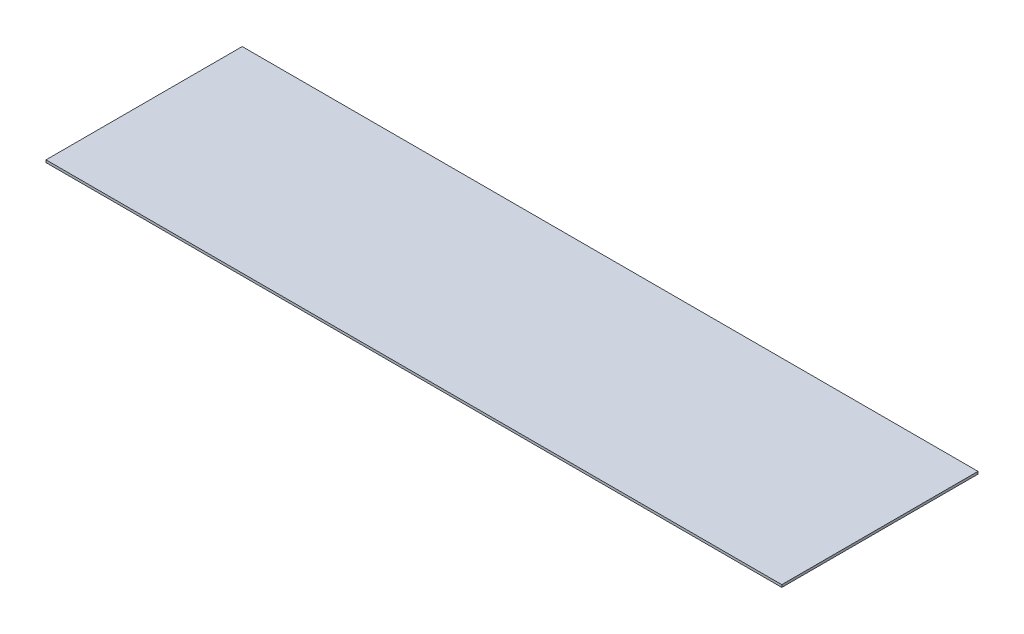
ISO-10303-21;
HEADER;
FILE_DESCRIPTION(('STEP AP214'),'2;1');
FILE_NAME('part.step','',(''),(''),'','','');
FILE_SCHEMA(('AUTOMOTIVE_DESIGN { 1 0 10303 214 1 1 1 1 }'));
ENDSEC;
DATA;
#1=APPLICATION_CONTEXT('core data for automotive mechanical design processes');
#2=APPLICATION_PROTOCOL_DEFINITION('international standard','automotive_design',2000,#1);
#3=PRODUCT_CONTEXT('',#1,'mechanical');
#4=PRODUCT('Part','Part','',(#3));
#5=PRODUCT_RELATED_PRODUCT_CATEGORY('part','',(#4));
#6=PRODUCT_DEFINITION_FORMATION('','',#4);
#7=PRODUCT_DEFINITION_CONTEXT('part definition',#1,'design');
#8=PRODUCT_DEFINITION('design','',#6,#7);
#9=PRODUCT_DEFINITION_SHAPE('','',#8);
#10=(LENGTH_UNIT() NAMED_UNIT(*) SI_UNIT(.MILLI.,.METRE.));
#11=(NAMED_UNIT(*) PLANE_ANGLE_UNIT() SI_UNIT($,.RADIAN.));
#12=(NAMED_UNIT(*) SI_UNIT($,.STERADIAN.) SOLID_ANGLE_UNIT());
#13=UNCERTAINTY_MEASURE_WITH_UNIT(LENGTH_MEASURE(1.E-05),#10,'distance_accuracy_value','');
#14=(GEOMETRIC_REPRESENTATION_CONTEXT(3) GLOBAL_UNCERTAINTY_ASSIGNED_CONTEXT((#13)) GLOBAL_UNIT_ASSIGNED_CONTEXT((#10,
#11,#12)) REPRESENTATION_CONTEXT('',''));
#15=CARTESIAN_POINT('',(0.,0.,0.));
#16=DIRECTION('',(0.,0.,1.));
#17=DIRECTION('',(1.,0.,0.));
#18=AXIS2_PLACEMENT_3D('',#15,#16,#17);
#19=CARTESIAN_POINT('',(750.,2.5,-200.));
#20=DIRECTION('',(-1.,0.,0.));
#21=DIRECTION('',(0.,0.,1.));
#22=AXIS2_PLACEMENT_3D('',#19,#20,#21);
#23=PLANE('',#22);
#24=DIRECTION('',(0.,0.,-1.));
#25=VECTOR('',#24,1.);
#26=CARTESIAN_POINT('',(750.,-2.5,-200.));
#27=LINE('',#26,#25);
#28=CARTESIAN_POINT('',(750.,-2.5,200.));
#29=VERTEX_POINT('',#28);
#30=CARTESIAN_POINT('',(750.,-2.5,-200.));
#31=VERTEX_POINT('',#30);
#32=EDGE_CURVE('E96',#29,#31,#27,.T.);
#33=ORIENTED_EDGE('',*,*,#32,.T.);
#34=DIRECTION('',(0.,-1.,0.));
#35=VECTOR('',#34,1.);
#36=CARTESIAN_POINT('',(750.,2.5,-200.));
#37=LINE('',#36,#35);
#38=CARTESIAN_POINT('',(750.,2.5,-200.));
#39=VERTEX_POINT('',#38);
#40=EDGE_CURVE('E11',#39,#31,#37,.T.);
#41=ORIENTED_EDGE('',*,*,#40,.F.);
#42=DIRECTION('',(0.,0.,-1.));
#43=VECTOR('',#42,1.);
#44=CARTESIAN_POINT('',(750.,2.5,-200.));
#45=LINE('',#44,#43);
#46=CARTESIAN_POINT('',(750.,2.5,200.));
#47=VERTEX_POINT('',#46);
#48=EDGE_CURVE('E84',#47,#39,#45,.T.);
#49=ORIENTED_EDGE('',*,*,#48,.F.);
#50=DIRECTION('',(0.,-1.,0.));
#51=VECTOR('',#50,1.);
#52=CARTESIAN_POINT('',(750.,2.5,200.));
#53=LINE('',#52,#51);
#54=EDGE_CURVE('E92',#47,#29,#53,.T.);
#55=ORIENTED_EDGE('',*,*,#54,.T.);
#56=EDGE_LOOP('',(#33,#41,#49,#55));
#57=FACE_BOUND('',#56,.T.);
#58=ADVANCED_FACE('F33',(#57),#23,.F.);
#59=CARTESIAN_POINT('',(-750.,2.5,-200.));
#60=DIRECTION('',(0.,0.,1.));
#61=DIRECTION('',(1.,0.,0.));
#62=AXIS2_PLACEMENT_3D('',#59,#60,#61);
#63=PLANE('',#62);
#64=DIRECTION('',(-1.,0.,0.));
#65=VECTOR('',#64,1.);
#66=CARTESIAN_POINT('',(-750.,-2.5,-200.));
#67=LINE('',#66,#65);
#68=CARTESIAN_POINT('',(-750.,-2.5,-200.));
#69=VERTEX_POINT('',#68);
#70=EDGE_CURVE('E88',#31,#69,#67,.T.);
#71=ORIENTED_EDGE('',*,*,#70,.T.);
#72=DIRECTION('',(0.,-1.,0.));
#73=VECTOR('',#72,1.);
#74=CARTESIAN_POINT('',(-750.,2.5,-200.));
#75=LINE('',#74,#73);
#76=CARTESIAN_POINT('',(-750.,2.5,-200.));
#77=VERTEX_POINT('',#76);
#78=EDGE_CURVE('E41',#77,#69,#75,.T.);
#79=ORIENTED_EDGE('',*,*,#78,.F.);
#80=DIRECTION('',(-1.,0.,0.));
#81=VECTOR('',#80,1.);
#82=CARTESIAN_POINT('',(-750.,2.5,-200.));
#83=LINE('',#82,#81);
#84=EDGE_CURVE('E79',#39,#77,#83,.T.);
#85=ORIENTED_EDGE('',*,*,#84,.F.);
#86=ORIENTED_EDGE('',*,*,#40,.T.);
#87=EDGE_LOOP('',(#71,#79,#85,#86));
#88=FACE_BOUND('',#87,.T.);
#89=ADVANCED_FACE('F87',(#88),#63,.F.);
#90=CARTESIAN_POINT('',(-750.,2.5,-200.));
#91=DIRECTION('',(1.,0.,0.));
#92=DIRECTION('',(0.,0.,-1.));
#93=AXIS2_PLACEMENT_3D('',#90,#91,#92);
#94=PLANE('',#93);
#95=DIRECTION('',(0.,0.,1.));
#96=VECTOR('',#95,1.);
#97=CARTESIAN_POINT('',(-750.,-2.5,-200.));
#98=LINE('',#97,#96);
#99=CARTESIAN_POINT('',(-750.,-2.5,200.));
#100=VERTEX_POINT('',#99);
#101=EDGE_CURVE('E66',#69,#100,#98,.T.);
#102=ORIENTED_EDGE('',*,*,#101,.T.);
#103=DIRECTION('',(0.,-1.,0.));
#104=VECTOR('',#103,1.);
#105=CARTESIAN_POINT('',(-750.,2.5,200.));
#106=LINE('',#105,#104);
#107=CARTESIAN_POINT('',(-750.,2.5,200.));
#108=VERTEX_POINT('',#107);
#109=EDGE_CURVE('E89',#108,#100,#106,.T.);
#110=ORIENTED_EDGE('',*,*,#109,.F.);
#111=DIRECTION('',(0.,0.,1.));
#112=VECTOR('',#111,1.);
#113=CARTESIAN_POINT('',(-750.,2.5,-200.));
#114=LINE('',#113,#112);
#115=EDGE_CURVE('E82',#77,#108,#114,.T.);
#116=ORIENTED_EDGE('',*,*,#115,.F.);
#117=ORIENTED_EDGE('',*,*,#78,.T.);
#118=EDGE_LOOP('',(#102,#110,#116,#117));
#119=FACE_BOUND('',#118,.T.);
#120=ADVANCED_FACE('F90',(#119),#94,.F.);
#121=CARTESIAN_POINT('',(-750.,2.5,200.));
#122=DIRECTION('',(0.,0.,-1.));
#123=DIRECTION('',(-1.,0.,0.));
#124=AXIS2_PLACEMENT_3D('',#121,#122,#123);
#125=PLANE('',#124);
#126=DIRECTION('',(1.,0.,0.));
#127=VECTOR('',#126,1.);
#128=CARTESIAN_POINT('',(-750.,-2.5,200.));
#129=LINE('',#128,#127);
#130=EDGE_CURVE('E72',#100,#29,#129,.T.);
#131=ORIENTED_EDGE('',*,*,#130,.T.);
#132=ORIENTED_EDGE('',*,*,#54,.F.);
#133=DIRECTION('',(1.,0.,0.));
#134=VECTOR('',#133,1.);
#135=CARTESIAN_POINT('',(-750.,2.5,200.));
#136=LINE('',#135,#134);
#137=EDGE_CURVE('E49',#108,#47,#136,.T.);
#138=ORIENTED_EDGE('',*,*,#137,.F.);
#139=ORIENTED_EDGE('',*,*,#109,.T.);
#140=EDGE_LOOP('',(#131,#132,#138,#139));
#141=FACE_BOUND('',#140,.T.);
#142=ADVANCED_FACE('F103',(#141),#125,.F.);
#143=CARTESIAN_POINT('',(0.,2.5,0.));
#144=DIRECTION('',(0.,1.,0.));
#145=DIRECTION('',(0.,0.,1.));
#146=AXIS2_PLACEMENT_3D('',#143,#144,#145);
#147=PLANE('',#146);
#148=ORIENTED_EDGE('',*,*,#48,.T.);
#149=ORIENTED_EDGE('',*,*,#84,.T.);
#150=ORIENTED_EDGE('',*,*,#115,.T.);
#151=ORIENTED_EDGE('',*,*,#137,.T.);
#152=EDGE_LOOP('',(#148,#149,#150,#151));
#153=FACE_BOUND('',#152,.T.);
#154=ADVANCED_FACE('F80',(#153),#147,.T.);
#155=CARTESIAN_POINT('',(0.,-2.5,0.));
#156=DIRECTION('',(0.,1.,0.));
#157=DIRECTION('',(0.,0.,1.));
#158=AXIS2_PLACEMENT_3D('',#155,#156,#157);
#159=PLANE('',#158);
#160=ORIENTED_EDGE('',*,*,#32,.F.);
#161=ORIENTED_EDGE('',*,*,#130,.F.);
#162=ORIENTED_EDGE('',*,*,#101,.F.);
#163=ORIENTED_EDGE('',*,*,#70,.F.);
#164=EDGE_LOOP('',(#160,#161,#162,#163));
#165=FACE_BOUND('',#164,.T.);
#166=ADVANCED_FACE('F106',(#165),#159,.F.);
#167=CLOSED_SHELL('',(#58,#89,#120,#142,#154,#166));
#168=MANIFOLD_SOLID_BREP('B2',#167);
#169=ADVANCED_BREP_SHAPE_REPRESENTATION('',(#18,#168),#14);
#170=SHAPE_DEFINITION_REPRESENTATION(#9,#169);
ENDSEC;
END-ISO-10303-21;
